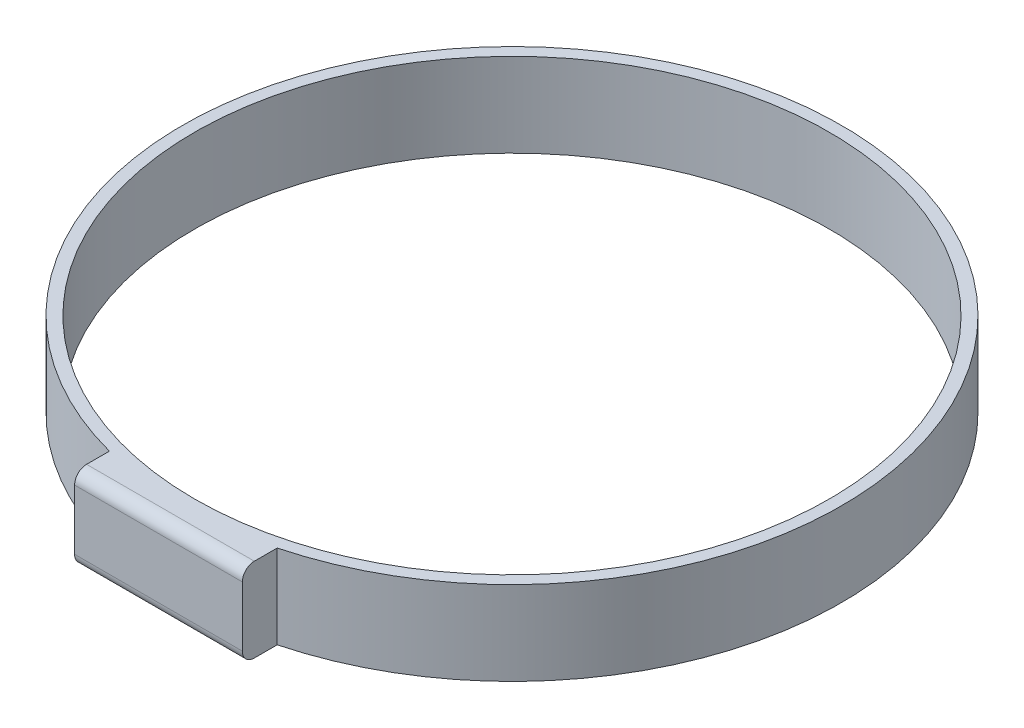
ISO-10303-21;
HEADER;
FILE_DESCRIPTION(('STEP AP214'),'2;1');
FILE_NAME('part.step','',(''),(''),'','','');
FILE_SCHEMA(('AUTOMOTIVE_DESIGN { 1 0 10303 214 1 1 1 1 }'));
ENDSEC;
DATA;
#1=APPLICATION_CONTEXT('core data for automotive mechanical design processes');
#2=APPLICATION_PROTOCOL_DEFINITION('international standard','automotive_design',2000,#1);
#3=PRODUCT_CONTEXT('',#1,'mechanical');
#4=PRODUCT('Part','Part','',(#3));
#5=PRODUCT_RELATED_PRODUCT_CATEGORY('part','',(#4));
#6=PRODUCT_DEFINITION_FORMATION('','',#4);
#7=PRODUCT_DEFINITION_CONTEXT('part definition',#1,'design');
#8=PRODUCT_DEFINITION('design','',#6,#7);
#9=PRODUCT_DEFINITION_SHAPE('','',#8);
#10=(LENGTH_UNIT() NAMED_UNIT(*) SI_UNIT(.MILLI.,.METRE.));
#11=(NAMED_UNIT(*) PLANE_ANGLE_UNIT() SI_UNIT($,.RADIAN.));
#12=(NAMED_UNIT(*) SI_UNIT($,.STERADIAN.) SOLID_ANGLE_UNIT());
#13=UNCERTAINTY_MEASURE_WITH_UNIT(LENGTH_MEASURE(1.E-05),#10,'distance_accuracy_value','');
#14=(GEOMETRIC_REPRESENTATION_CONTEXT(3) GLOBAL_UNCERTAINTY_ASSIGNED_CONTEXT((#13)) GLOBAL_UNIT_ASSIGNED_CONTEXT((#10,
#11,#12)) REPRESENTATION_CONTEXT('',''));
#15=CARTESIAN_POINT('',(0.,0.,0.));
#16=DIRECTION('',(0.,0.,1.));
#17=DIRECTION('',(1.,0.,0.));
#18=AXIS2_PLACEMENT_3D('',#15,#16,#17);
#19=CARTESIAN_POINT('',(0.,7.,0.));
#20=DIRECTION('',(0.,-1.,0.));
#21=DIRECTION('',(0.,0.,-1.));
#22=AXIS2_PLACEMENT_3D('',#19,#20,#21);
#23=CYLINDRICAL_SURFACE('',#22,27.5);
#24=DIRECTION('',(0.,-1.,0.));
#25=VECTOR('',#24,1.);
#26=CARTESIAN_POINT('',(-7.,7.,26.5941722939444));
#27=LINE('',#26,#25);
#28=CARTESIAN_POINT('',(-7.,7.,26.5941722939444));
#29=VERTEX_POINT('',#28);
#30=CARTESIAN_POINT('',(-7.,0.,26.5941722939444));
#31=VERTEX_POINT('',#30);
#32=EDGE_CURVE('E94',#29,#31,#27,.T.);
#33=ORIENTED_EDGE('',*,*,#32,.F.);
#34=CARTESIAN_POINT('',(0.,7.,0.));
#35=DIRECTION('',(0.,1.,0.));
#36=DIRECTION('',(0.,0.,1.));
#37=AXIS2_PLACEMENT_3D('',#34,#35,#36);
#38=CIRCLE('',#37,27.5);
#39=CARTESIAN_POINT('',(7.,7.,26.5941722939444));
#40=VERTEX_POINT('',#39);
#41=EDGE_CURVE('E106',#40,#29,#38,.T.);
#42=ORIENTED_EDGE('',*,*,#41,.F.);
#43=DIRECTION('',(0.,-1.,0.));
#44=VECTOR('',#43,1.);
#45=CARTESIAN_POINT('',(7.,7.,26.5941722939444));
#46=LINE('',#45,#44);
#47=CARTESIAN_POINT('',(7.,0.,26.5941722939444));
#48=VERTEX_POINT('',#47);
#49=EDGE_CURVE('E111',#48,#40,#46,.F.);
#50=ORIENTED_EDGE('',*,*,#49,.F.);
#51=CARTESIAN_POINT('',(0.,0.,0.));
#52=DIRECTION('',(0.,1.,0.));
#53=DIRECTION('',(0.,0.,1.));
#54=AXIS2_PLACEMENT_3D('',#51,#52,#53);
#55=CIRCLE('',#54,27.5);
#56=EDGE_CURVE('E108',#48,#31,#55,.T.);
#57=ORIENTED_EDGE('',*,*,#56,.T.);
#58=EDGE_LOOP('',(#33,#42,#50,#57));
#59=FACE_BOUND('',#58,.T.);
#60=ADVANCED_FACE('F39',(#59),#23,.T.);
#61=CARTESIAN_POINT('',(0.,7.,0.));
#62=DIRECTION('',(0.,1.,0.));
#63=DIRECTION('',(0.,0.,1.));
#64=AXIS2_PLACEMENT_3D('',#61,#62,#63);
#65=PLANE('',#64);
#66=DIRECTION('',(0.,0.,-1.));
#67=VECTOR('',#66,1.);
#68=CARTESIAN_POINT('',(-7.,7.,29.5));
#69=LINE('',#68,#67);
#70=CARTESIAN_POINT('',(-7.,7.,28.5));
#71=VERTEX_POINT('',#70);
#72=EDGE_CURVE('E91',#71,#29,#69,.T.);
#73=ORIENTED_EDGE('',*,*,#72,.F.);
#74=DIRECTION('',(-1.,0.,0.));
#75=VECTOR('',#74,1.);
#76=CARTESIAN_POINT('',(0.,7.,28.5));
#77=LINE('',#76,#75);
#78=CARTESIAN_POINT('',(7.,7.,28.5));
#79=VERTEX_POINT('',#78);
#80=EDGE_CURVE('E11',#71,#79,#77,.F.);
#81=ORIENTED_EDGE('',*,*,#80,.T.);
#82=DIRECTION('',(0.,0.,-1.));
#83=VECTOR('',#82,1.);
#84=CARTESIAN_POINT('',(7.,7.,29.5));
#85=LINE('',#84,#83);
#86=EDGE_CURVE('E100',#79,#40,#85,.T.);
#87=ORIENTED_EDGE('',*,*,#86,.T.);
#88=ORIENTED_EDGE('',*,*,#41,.T.);
#89=EDGE_LOOP('',(#73,#81,#87,#88));
#90=FACE_BOUND('',#89,.T.);
#91=CARTESIAN_POINT('',(0.,7.,0.));
#92=DIRECTION('',(0.,1.,0.));
#93=DIRECTION('',(0.,0.,1.));
#94=AXIS2_PLACEMENT_3D('',#91,#92,#93);
#95=CIRCLE('',#94,26.5);
#96=CARTESIAN_POINT('',(0.,7.,26.5));
#97=VERTEX_POINT('',#96);
#98=EDGE_CURVE('E122',#97,#97,#95,.T.);
#99=ORIENTED_EDGE('',*,*,#98,.F.);
#100=EDGE_LOOP('',(#99));
#101=FACE_BOUND('',#100,.T.);
#102=ADVANCED_FACE('F113',(#90,#101),#65,.T.);
#103=CARTESIAN_POINT('',(0.,0.,0.));
#104=DIRECTION('',(0.,1.,0.));
#105=DIRECTION('',(0.,0.,1.));
#106=AXIS2_PLACEMENT_3D('',#103,#104,#105);
#107=PLANE('',#106);
#108=DIRECTION('',(0.,0.,-1.));
#109=VECTOR('',#108,1.);
#110=CARTESIAN_POINT('',(7.,0.,29.5));
#111=LINE('',#110,#109);
#112=CARTESIAN_POINT('',(7.,0.,28.5));
#113=VERTEX_POINT('',#112);
#114=EDGE_CURVE('E161',#113,#48,#111,.T.);
#115=ORIENTED_EDGE('',*,*,#114,.F.);
#116=DIRECTION('',(1.,0.,0.));
#117=VECTOR('',#116,1.);
#118=CARTESIAN_POINT('',(-7.,0.,28.5));
#119=LINE('',#118,#117);
#120=CARTESIAN_POINT('',(-7.,0.,28.5));
#121=VERTEX_POINT('',#120);
#122=EDGE_CURVE('E63',#113,#121,#119,.F.);
#123=ORIENTED_EDGE('',*,*,#122,.T.);
#124=DIRECTION('',(0.,0.,-1.));
#125=VECTOR('',#124,1.);
#126=CARTESIAN_POINT('',(-7.,0.,29.5));
#127=LINE('',#126,#125);
#128=EDGE_CURVE('E148',#121,#31,#127,.T.);
#129=ORIENTED_EDGE('',*,*,#128,.T.);
#130=ORIENTED_EDGE('',*,*,#56,.F.);
#131=EDGE_LOOP('',(#115,#123,#129,#130));
#132=FACE_BOUND('',#131,.T.);
#133=CARTESIAN_POINT('',(0.,0.,0.));
#134=DIRECTION('',(0.,1.,0.));
#135=DIRECTION('',(0.,0.,1.));
#136=AXIS2_PLACEMENT_3D('',#133,#134,#135);
#137=CIRCLE('',#136,26.5);
#138=CARTESIAN_POINT('',(0.,0.,26.5));
#139=VERTEX_POINT('',#138);
#140=EDGE_CURVE('E125',#139,#139,#137,.T.);
#141=ORIENTED_EDGE('',*,*,#140,.T.);
#142=EDGE_LOOP('',(#141));
#143=FACE_BOUND('',#142,.T.);
#144=ADVANCED_FACE('F162',(#132,#143),#107,.F.);
#145=CARTESIAN_POINT('',(0.,7.,0.));
#146=DIRECTION('',(0.,-1.,0.));
#147=DIRECTION('',(0.,0.,-1.));
#148=AXIS2_PLACEMENT_3D('',#145,#146,#147);
#149=CYLINDRICAL_SURFACE('',#148,26.5);
#150=ORIENTED_EDGE('',*,*,#140,.F.);
#151=EDGE_LOOP('',(#150));
#152=FACE_BOUND('',#151,.T.);
#153=ORIENTED_EDGE('',*,*,#98,.T.);
#154=EDGE_LOOP('',(#153));
#155=FACE_BOUND('',#154,.T.);
#156=ADVANCED_FACE('F178',(#152,#155),#149,.F.);
#157=CARTESIAN_POINT('',(-7.,7.,29.5));
#158=DIRECTION('',(1.,0.,0.));
#159=DIRECTION('',(0.,1.,0.));
#160=AXIS2_PLACEMENT_3D('',#157,#158,#159);
#161=PLANE('',#160);
#162=ORIENTED_EDGE('',*,*,#128,.F.);
#163=CARTESIAN_POINT('',(-7.,1.,28.5));
#164=DIRECTION('',(1.,0.,0.));
#165=DIRECTION('',(0.,1.,0.));
#166=AXIS2_PLACEMENT_3D('',#163,#164,#165);
#167=CIRCLE('',#166,1.);
#168=CARTESIAN_POINT('',(-7.,1.,29.5));
#169=VERTEX_POINT('',#168);
#170=EDGE_CURVE('E48',#121,#169,#167,.F.);
#171=ORIENTED_EDGE('',*,*,#170,.T.);
#172=DIRECTION('',(0.,-1.,0.));
#173=VECTOR('',#172,1.);
#174=CARTESIAN_POINT('',(-7.,7.,29.5));
#175=LINE('',#174,#173);
#176=CARTESIAN_POINT('',(-7.,6.,29.5));
#177=VERTEX_POINT('',#176);
#178=EDGE_CURVE('E147',#177,#169,#175,.T.);
#179=ORIENTED_EDGE('',*,*,#178,.F.);
#180=CARTESIAN_POINT('',(-7.,6.,28.5));
#181=DIRECTION('',(1.,0.,0.));
#182=DIRECTION('',(0.,1.,0.));
#183=AXIS2_PLACEMENT_3D('',#180,#181,#182);
#184=CIRCLE('',#183,1.);
#185=EDGE_CURVE('E55',#177,#71,#184,.F.);
#186=ORIENTED_EDGE('',*,*,#185,.T.);
#187=ORIENTED_EDGE('',*,*,#72,.T.);
#188=ORIENTED_EDGE('',*,*,#32,.T.);
#189=EDGE_LOOP('',(#162,#171,#179,#186,#187,#188));
#190=FACE_BOUND('',#189,.T.);
#191=ADVANCED_FACE('F93',(#190),#161,.F.);
#192=CARTESIAN_POINT('',(7.,7.,29.5));
#193=DIRECTION('',(-1.,0.,0.));
#194=DIRECTION('',(0.,-1.,0.));
#195=AXIS2_PLACEMENT_3D('',#192,#193,#194);
#196=PLANE('',#195);
#197=DIRECTION('',(0.,1.,0.));
#198=VECTOR('',#197,1.);
#199=CARTESIAN_POINT('',(7.,7.,29.5));
#200=LINE('',#199,#198);
#201=CARTESIAN_POINT('',(7.,1.,29.5));
#202=VERTEX_POINT('',#201);
#203=CARTESIAN_POINT('',(7.,6.,29.5));
#204=VERTEX_POINT('',#203);
#205=EDGE_CURVE('E101',#202,#204,#200,.T.);
#206=ORIENTED_EDGE('',*,*,#205,.F.);
#207=CARTESIAN_POINT('',(7.,1.,28.5));
#208=DIRECTION('',(-1.,0.,0.));
#209=DIRECTION('',(0.,-1.,0.));
#210=AXIS2_PLACEMENT_3D('',#207,#208,#209);
#211=CIRCLE('',#210,1.);
#212=EDGE_CURVE('E138',#202,#113,#211,.F.);
#213=ORIENTED_EDGE('',*,*,#212,.T.);
#214=ORIENTED_EDGE('',*,*,#114,.T.);
#215=ORIENTED_EDGE('',*,*,#49,.T.);
#216=ORIENTED_EDGE('',*,*,#86,.F.);
#217=CARTESIAN_POINT('',(7.,6.,28.5));
#218=DIRECTION('',(-1.,0.,0.));
#219=DIRECTION('',(0.,-1.,0.));
#220=AXIS2_PLACEMENT_3D('',#217,#218,#219);
#221=CIRCLE('',#220,1.);
#222=EDGE_CURVE('E135',#79,#204,#221,.F.);
#223=ORIENTED_EDGE('',*,*,#222,.T.);
#224=EDGE_LOOP('',(#206,#213,#214,#215,#216,#223));
#225=FACE_BOUND('',#224,.T.);
#226=ADVANCED_FACE('F160',(#225),#196,.F.);
#227=CARTESIAN_POINT('',(0.,0.,29.5));
#228=DIRECTION('',(0.,0.,1.));
#229=DIRECTION('',(1.,0.,0.));
#230=AXIS2_PLACEMENT_3D('',#227,#228,#229);
#231=PLANE('',#230);
#232=ORIENTED_EDGE('',*,*,#178,.T.);
#233=DIRECTION('',(1.,0.,0.));
#234=VECTOR('',#233,1.);
#235=CARTESIAN_POINT('',(7.,1.,29.5));
#236=LINE('',#235,#234);
#237=EDGE_CURVE('E131',#169,#202,#236,.T.);
#238=ORIENTED_EDGE('',*,*,#237,.T.);
#239=ORIENTED_EDGE('',*,*,#205,.T.);
#240=DIRECTION('',(-1.,0.,0.));
#241=VECTOR('',#240,1.);
#242=CARTESIAN_POINT('',(0.,6.,29.5));
#243=LINE('',#242,#241);
#244=EDGE_CURVE('E110',#204,#177,#243,.T.);
#245=ORIENTED_EDGE('',*,*,#244,.T.);
#246=EDGE_LOOP('',(#232,#238,#239,#245));
#247=FACE_BOUND('',#246,.T.);
#248=ADVANCED_FACE('F152',(#247),#231,.T.);
#249=CARTESIAN_POINT('',(0.,1.,28.5));
#250=DIRECTION('',(-1.,0.,0.));
#251=DIRECTION('',(0.,0.,1.));
#252=AXIS2_PLACEMENT_3D('',#249,#250,#251);
#253=CYLINDRICAL_SURFACE('',#252,1.);
#254=ORIENTED_EDGE('',*,*,#170,.F.);
#255=ORIENTED_EDGE('',*,*,#122,.F.);
#256=ORIENTED_EDGE('',*,*,#212,.F.);
#257=ORIENTED_EDGE('',*,*,#237,.F.);
#258=EDGE_LOOP('',(#254,#255,#256,#257));
#259=FACE_BOUND('',#258,.T.);
#260=ADVANCED_FACE('F158',(#259),#253,.T.);
#261=CARTESIAN_POINT('',(0.,6.,28.5));
#262=DIRECTION('',(-1.,0.,0.));
#263=DIRECTION('',(0.,0.,1.));
#264=AXIS2_PLACEMENT_3D('',#261,#262,#263);
#265=CYLINDRICAL_SURFACE('',#264,1.);
#266=ORIENTED_EDGE('',*,*,#222,.F.);
#267=ORIENTED_EDGE('',*,*,#80,.F.);
#268=ORIENTED_EDGE('',*,*,#185,.F.);
#269=ORIENTED_EDGE('',*,*,#244,.F.);
#270=EDGE_LOOP('',(#266,#267,#268,#269));
#271=FACE_BOUND('',#270,.T.);
#272=ADVANCED_FACE('F41',(#271),#265,.T.);
#273=CLOSED_SHELL('',(#60,#102,#144,#156,#191,#226,#248,#260,#272));
#274=MANIFOLD_SOLID_BREP('B2',#273);
#275=ADVANCED_BREP_SHAPE_REPRESENTATION('',(#18,#274),#14);
#276=SHAPE_DEFINITION_REPRESENTATION(#9,#275);
ENDSEC;
END-ISO-10303-21;
